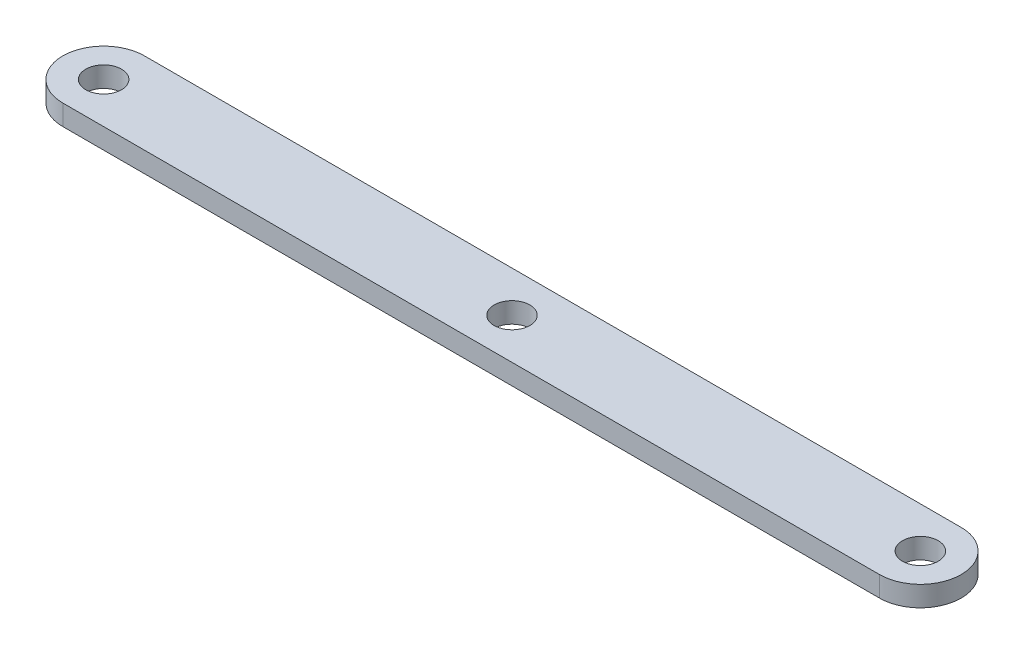
ISO-10303-21;
HEADER;
FILE_DESCRIPTION(('STEP AP214'),'2;1');
FILE_NAME('part.step','',(''),(''),'','','');
FILE_SCHEMA(('AUTOMOTIVE_DESIGN { 1 0 10303 214 1 1 1 1 }'));
ENDSEC;
DATA;
#1=APPLICATION_CONTEXT('core data for automotive mechanical design processes');
#2=APPLICATION_PROTOCOL_DEFINITION('international standard','automotive_design',2000,#1);
#3=PRODUCT_CONTEXT('',#1,'mechanical');
#4=PRODUCT('Part','Part','',(#3));
#5=PRODUCT_RELATED_PRODUCT_CATEGORY('part','',(#4));
#6=PRODUCT_DEFINITION_FORMATION('','',#4);
#7=PRODUCT_DEFINITION_CONTEXT('part definition',#1,'design');
#8=PRODUCT_DEFINITION('design','',#6,#7);
#9=PRODUCT_DEFINITION_SHAPE('','',#8);
#10=(LENGTH_UNIT() NAMED_UNIT(*) SI_UNIT(.MILLI.,.METRE.));
#11=(NAMED_UNIT(*) PLANE_ANGLE_UNIT() SI_UNIT($,.RADIAN.));
#12=(NAMED_UNIT(*) SI_UNIT($,.STERADIAN.) SOLID_ANGLE_UNIT());
#13=UNCERTAINTY_MEASURE_WITH_UNIT(LENGTH_MEASURE(1.E-05),#10,'distance_accuracy_value','');
#14=(GEOMETRIC_REPRESENTATION_CONTEXT(3) GLOBAL_UNCERTAINTY_ASSIGNED_CONTEXT((#13)) GLOBAL_UNIT_ASSIGNED_CONTEXT((#10,
#11,#12)) REPRESENTATION_CONTEXT('',''));
#15=CARTESIAN_POINT('',(0.,0.,0.));
#16=DIRECTION('',(0.,0.,1.));
#17=DIRECTION('',(1.,0.,0.));
#18=AXIS2_PLACEMENT_3D('',#15,#16,#17);
#19=CARTESIAN_POINT('',(-44.9032515738736,2.,-4.));
#20=DIRECTION('',(0.,0.,-1.));
#21=DIRECTION('',(-1.,0.,0.));
#22=AXIS2_PLACEMENT_3D('',#19,#20,#21);
#23=PLANE('',#22);
#24=DIRECTION('',(1.,0.,0.));
#25=VECTOR('',#24,1.);
#26=CARTESIAN_POINT('',(-44.9032515738736,0.,-4.));
#27=LINE('',#26,#25);
#28=CARTESIAN_POINT('',(-44.9032515738736,0.,-4.));
#29=VERTEX_POINT('',#28);
#30=CARTESIAN_POINT('',(35.0967484261266,0.,-4.));
#31=VERTEX_POINT('',#30);
#32=EDGE_CURVE('E103',#29,#31,#27,.T.);
#33=ORIENTED_EDGE('',*,*,#32,.F.);
#34=DIRECTION('',(0.,-1.,0.));
#35=VECTOR('',#34,1.);
#36=CARTESIAN_POINT('',(-44.9032515738736,2.,-4.));
#37=LINE('',#36,#35);
#38=CARTESIAN_POINT('',(-44.9032515738736,2.,-4.));
#39=VERTEX_POINT('',#38);
#40=EDGE_CURVE('E11',#39,#29,#37,.T.);
#41=ORIENTED_EDGE('',*,*,#40,.F.);
#42=DIRECTION('',(1.,0.,0.));
#43=VECTOR('',#42,1.);
#44=CARTESIAN_POINT('',(-44.9032515738736,2.,-4.));
#45=LINE('',#44,#43);
#46=CARTESIAN_POINT('',(35.0967484261266,2.,-4.));
#47=VERTEX_POINT('',#46);
#48=EDGE_CURVE('E95',#39,#47,#45,.T.);
#49=ORIENTED_EDGE('',*,*,#48,.T.);
#50=DIRECTION('',(0.,-1.,0.));
#51=VECTOR('',#50,1.);
#52=CARTESIAN_POINT('',(35.0967484261266,2.,-4.));
#53=LINE('',#52,#51);
#54=EDGE_CURVE('E42',#47,#31,#53,.T.);
#55=ORIENTED_EDGE('',*,*,#54,.T.);
#56=EDGE_LOOP('',(#33,#41,#49,#55));
#57=FACE_BOUND('',#56,.T.);
#58=ADVANCED_FACE('F39',(#57),#23,.T.);
#59=CARTESIAN_POINT('',(-44.9032515738736,2.,0.));
#60=DIRECTION('',(0.,-1.,0.));
#61=DIRECTION('',(0.,0.,-1.));
#62=AXIS2_PLACEMENT_3D('',#59,#60,#61);
#63=CYLINDRICAL_SURFACE('',#62,4.);
#64=CARTESIAN_POINT('',(-44.9032515738736,0.,0.));
#65=DIRECTION('',(0.,1.,0.));
#66=DIRECTION('',(0.,0.,1.));
#67=AXIS2_PLACEMENT_3D('',#64,#65,#66);
#68=CIRCLE('',#67,4.);
#69=CARTESIAN_POINT('',(-44.9032515738736,0.,4.));
#70=VERTEX_POINT('',#69);
#71=EDGE_CURVE('E110',#29,#70,#68,.T.);
#72=ORIENTED_EDGE('',*,*,#71,.T.);
#73=DIRECTION('',(0.,-1.,0.));
#74=VECTOR('',#73,1.);
#75=CARTESIAN_POINT('',(-44.9032515738736,2.,4.));
#76=LINE('',#75,#74);
#77=CARTESIAN_POINT('',(-44.9032515738736,2.,4.));
#78=VERTEX_POINT('',#77);
#79=EDGE_CURVE('E48',#78,#70,#76,.T.);
#80=ORIENTED_EDGE('',*,*,#79,.F.);
#81=CARTESIAN_POINT('',(-44.9032515738736,2.,0.));
#82=DIRECTION('',(0.,1.,0.));
#83=DIRECTION('',(0.,0.,1.));
#84=AXIS2_PLACEMENT_3D('',#81,#82,#83);
#85=CIRCLE('',#84,4.);
#86=EDGE_CURVE('E98',#39,#78,#85,.T.);
#87=ORIENTED_EDGE('',*,*,#86,.F.);
#88=ORIENTED_EDGE('',*,*,#40,.T.);
#89=EDGE_LOOP('',(#72,#80,#87,#88));
#90=FACE_BOUND('',#89,.T.);
#91=ADVANCED_FACE('F161',(#90),#63,.T.);
#92=CARTESIAN_POINT('',(35.0967484261266,2.,4.));
#93=DIRECTION('',(0.,0.,1.));
#94=DIRECTION('',(1.,0.,0.));
#95=AXIS2_PLACEMENT_3D('',#92,#93,#94);
#96=PLANE('',#95);
#97=DIRECTION('',(-1.,0.,0.));
#98=VECTOR('',#97,1.);
#99=CARTESIAN_POINT('',(35.0967484261266,0.,4.));
#100=LINE('',#99,#98);
#101=CARTESIAN_POINT('',(35.0967484261266,0.,4.));
#102=VERTEX_POINT('',#101);
#103=EDGE_CURVE('E90',#102,#70,#100,.T.);
#104=ORIENTED_EDGE('',*,*,#103,.F.);
#105=DIRECTION('',(0.,-1.,0.));
#106=VECTOR('',#105,1.);
#107=CARTESIAN_POINT('',(35.0967484261266,2.,4.));
#108=LINE('',#107,#106);
#109=CARTESIAN_POINT('',(35.0967484261266,2.,4.));
#110=VERTEX_POINT('',#109);
#111=EDGE_CURVE('E86',#110,#102,#108,.T.);
#112=ORIENTED_EDGE('',*,*,#111,.F.);
#113=DIRECTION('',(-1.,0.,0.));
#114=VECTOR('',#113,1.);
#115=CARTESIAN_POINT('',(35.0967484261266,2.,4.));
#116=LINE('',#115,#114);
#117=EDGE_CURVE('E88',#110,#78,#116,.T.);
#118=ORIENTED_EDGE('',*,*,#117,.T.);
#119=ORIENTED_EDGE('',*,*,#79,.T.);
#120=EDGE_LOOP('',(#104,#112,#118,#119));
#121=FACE_BOUND('',#120,.T.);
#122=ADVANCED_FACE('F87',(#121),#96,.T.);
#123=CARTESIAN_POINT('',(35.0967484261266,2.,0.));
#124=DIRECTION('',(0.,-1.,0.));
#125=DIRECTION('',(0.,0.,-1.));
#126=AXIS2_PLACEMENT_3D('',#123,#124,#125);
#127=CYLINDRICAL_SURFACE('',#126,4.);
#128=CARTESIAN_POINT('',(35.0967484261266,0.,0.));
#129=DIRECTION('',(0.,1.,0.));
#130=DIRECTION('',(0.,0.,1.));
#131=AXIS2_PLACEMENT_3D('',#128,#129,#130);
#132=CIRCLE('',#131,4.);
#133=EDGE_CURVE('E106',#102,#31,#132,.T.);
#134=ORIENTED_EDGE('',*,*,#133,.T.);
#135=ORIENTED_EDGE('',*,*,#54,.F.);
#136=CARTESIAN_POINT('',(35.0967484261266,2.,0.));
#137=DIRECTION('',(0.,1.,0.));
#138=DIRECTION('',(0.,0.,1.));
#139=AXIS2_PLACEMENT_3D('',#136,#137,#138);
#140=CIRCLE('',#139,4.);
#141=EDGE_CURVE('E83',#110,#47,#140,.T.);
#142=ORIENTED_EDGE('',*,*,#141,.F.);
#143=ORIENTED_EDGE('',*,*,#111,.T.);
#144=EDGE_LOOP('',(#134,#135,#142,#143));
#145=FACE_BOUND('',#144,.T.);
#146=ADVANCED_FACE('F94',(#145),#127,.T.);
#147=CARTESIAN_POINT('',(35.0967484261266,2.,0.));
#148=DIRECTION('',(0.,1.,0.));
#149=DIRECTION('',(0.,0.,1.));
#150=AXIS2_PLACEMENT_3D('',#147,#148,#149);
#151=PLANE('',#150);
#152=CARTESIAN_POINT('',(-44.9032515738736,2.,0.));
#153=DIRECTION('',(0.,1.,0.));
#154=DIRECTION('',(0.,0.,1.));
#155=AXIS2_PLACEMENT_3D('',#152,#153,#154);
#156=CIRCLE('',#155,1.75);
#157=CARTESIAN_POINT('',(-44.9032515738736,2.,1.75));
#158=VERTEX_POINT('',#157);
#159=EDGE_CURVE('E125',#158,#158,#156,.T.);
#160=ORIENTED_EDGE('',*,*,#159,.F.);
#161=EDGE_LOOP('',(#160));
#162=FACE_BOUND('',#161,.T.);
#163=CARTESIAN_POINT('',(35.0967484261266,2.,0.));
#164=DIRECTION('',(0.,1.,0.));
#165=DIRECTION('',(0.,0.,1.));
#166=AXIS2_PLACEMENT_3D('',#163,#164,#165);
#167=CIRCLE('',#166,1.75);
#168=CARTESIAN_POINT('',(35.0967484261266,2.,1.75));
#169=VERTEX_POINT('',#168);
#170=EDGE_CURVE('E122',#169,#169,#167,.T.);
#171=ORIENTED_EDGE('',*,*,#170,.F.);
#172=EDGE_LOOP('',(#171));
#173=FACE_BOUND('',#172,.T.);
#174=CARTESIAN_POINT('',(-4.90325157387347,2.,0.));
#175=DIRECTION('',(0.,1.,0.));
#176=DIRECTION('',(0.,0.,1.));
#177=AXIS2_PLACEMENT_3D('',#174,#175,#176);
#178=CIRCLE('',#177,1.75);
#179=CARTESIAN_POINT('',(-4.90325157387347,2.,1.75));
#180=VERTEX_POINT('',#179);
#181=EDGE_CURVE('E116',#180,#180,#178,.T.);
#182=ORIENTED_EDGE('',*,*,#181,.F.);
#183=EDGE_LOOP('',(#182));
#184=FACE_BOUND('',#183,.T.);
#185=ORIENTED_EDGE('',*,*,#48,.F.);
#186=ORIENTED_EDGE('',*,*,#86,.T.);
#187=ORIENTED_EDGE('',*,*,#117,.F.);
#188=ORIENTED_EDGE('',*,*,#141,.T.);
#189=EDGE_LOOP('',(#185,#186,#187,#188));
#190=FACE_BOUND('',#189,.T.);
#191=ADVANCED_FACE('F97',(#162,#173,#184,#190),#151,.T.);
#192=CARTESIAN_POINT('',(35.0967484261266,0.,0.));
#193=DIRECTION('',(0.,1.,0.));
#194=DIRECTION('',(0.,0.,1.));
#195=AXIS2_PLACEMENT_3D('',#192,#193,#194);
#196=PLANE('',#195);
#197=CARTESIAN_POINT('',(-44.9032515738736,0.,0.));
#198=DIRECTION('',(0.,1.,0.));
#199=DIRECTION('',(0.,0.,1.));
#200=AXIS2_PLACEMENT_3D('',#197,#198,#199);
#201=CIRCLE('',#200,1.75);
#202=CARTESIAN_POINT('',(-44.9032515738736,0.,1.75));
#203=VERTEX_POINT('',#202);
#204=EDGE_CURVE('E107',#203,#203,#201,.T.);
#205=ORIENTED_EDGE('',*,*,#204,.T.);
#206=EDGE_LOOP('',(#205));
#207=FACE_BOUND('',#206,.T.);
#208=CARTESIAN_POINT('',(35.0967484261266,0.,0.));
#209=DIRECTION('',(0.,1.,0.));
#210=DIRECTION('',(0.,0.,1.));
#211=AXIS2_PLACEMENT_3D('',#208,#209,#210);
#212=CIRCLE('',#211,1.75);
#213=CARTESIAN_POINT('',(35.0967484261266,0.,1.75));
#214=VERTEX_POINT('',#213);
#215=EDGE_CURVE('E119',#214,#214,#212,.T.);
#216=ORIENTED_EDGE('',*,*,#215,.T.);
#217=EDGE_LOOP('',(#216));
#218=FACE_BOUND('',#217,.T.);
#219=CARTESIAN_POINT('',(-4.90325157387347,0.,0.));
#220=DIRECTION('',(0.,1.,0.));
#221=DIRECTION('',(0.,0.,1.));
#222=AXIS2_PLACEMENT_3D('',#219,#220,#221);
#223=CIRCLE('',#222,1.75);
#224=CARTESIAN_POINT('',(-4.90325157387347,0.,1.75));
#225=VERTEX_POINT('',#224);
#226=EDGE_CURVE('E113',#225,#225,#223,.T.);
#227=ORIENTED_EDGE('',*,*,#226,.T.);
#228=EDGE_LOOP('',(#227));
#229=FACE_BOUND('',#228,.T.);
#230=ORIENTED_EDGE('',*,*,#32,.T.);
#231=ORIENTED_EDGE('',*,*,#133,.F.);
#232=ORIENTED_EDGE('',*,*,#103,.T.);
#233=ORIENTED_EDGE('',*,*,#71,.F.);
#234=EDGE_LOOP('',(#230,#231,#232,#233));
#235=FACE_BOUND('',#234,.T.);
#236=ADVANCED_FACE('F131',(#207,#218,#229,#235),#196,.F.);
#237=CARTESIAN_POINT('',(-4.90325157387347,0.,0.));
#238=DIRECTION('',(0.,1.,0.));
#239=DIRECTION('',(0.,0.,1.));
#240=AXIS2_PLACEMENT_3D('',#237,#238,#239);
#241=CYLINDRICAL_SURFACE('',#240,1.75);
#242=ORIENTED_EDGE('',*,*,#226,.F.);
#243=EDGE_LOOP('',(#242));
#244=FACE_BOUND('',#243,.T.);
#245=ORIENTED_EDGE('',*,*,#181,.T.);
#246=EDGE_LOOP('',(#245));
#247=FACE_BOUND('',#246,.T.);
#248=ADVANCED_FACE('F148',(#244,#247),#241,.F.);
#249=CARTESIAN_POINT('',(35.0967484261266,0.,0.));
#250=DIRECTION('',(0.,1.,0.));
#251=DIRECTION('',(0.,0.,1.));
#252=AXIS2_PLACEMENT_3D('',#249,#250,#251);
#253=CYLINDRICAL_SURFACE('',#252,1.75);
#254=ORIENTED_EDGE('',*,*,#215,.F.);
#255=EDGE_LOOP('',(#254));
#256=FACE_BOUND('',#255,.T.);
#257=ORIENTED_EDGE('',*,*,#170,.T.);
#258=EDGE_LOOP('',(#257));
#259=FACE_BOUND('',#258,.T.);
#260=ADVANCED_FACE('F137',(#256,#259),#253,.F.);
#261=CARTESIAN_POINT('',(-44.9032515738736,0.,0.));
#262=DIRECTION('',(0.,1.,0.));
#263=DIRECTION('',(0.,0.,1.));
#264=AXIS2_PLACEMENT_3D('',#261,#262,#263);
#265=CYLINDRICAL_SURFACE('',#264,1.75);
#266=ORIENTED_EDGE('',*,*,#204,.F.);
#267=EDGE_LOOP('',(#266));
#268=FACE_BOUND('',#267,.T.);
#269=ORIENTED_EDGE('',*,*,#159,.T.);
#270=EDGE_LOOP('',(#269));
#271=FACE_BOUND('',#270,.T.);
#272=ADVANCED_FACE('F134',(#268,#271),#265,.F.);
#273=CLOSED_SHELL('',(#58,#91,#122,#146,#191,#236,#248,#260,#272));
#274=MANIFOLD_SOLID_BREP('B2',#273);
#275=ADVANCED_BREP_SHAPE_REPRESENTATION('',(#18,#274),#14);
#276=SHAPE_DEFINITION_REPRESENTATION(#9,#275);
ENDSEC;
END-ISO-10303-21;
